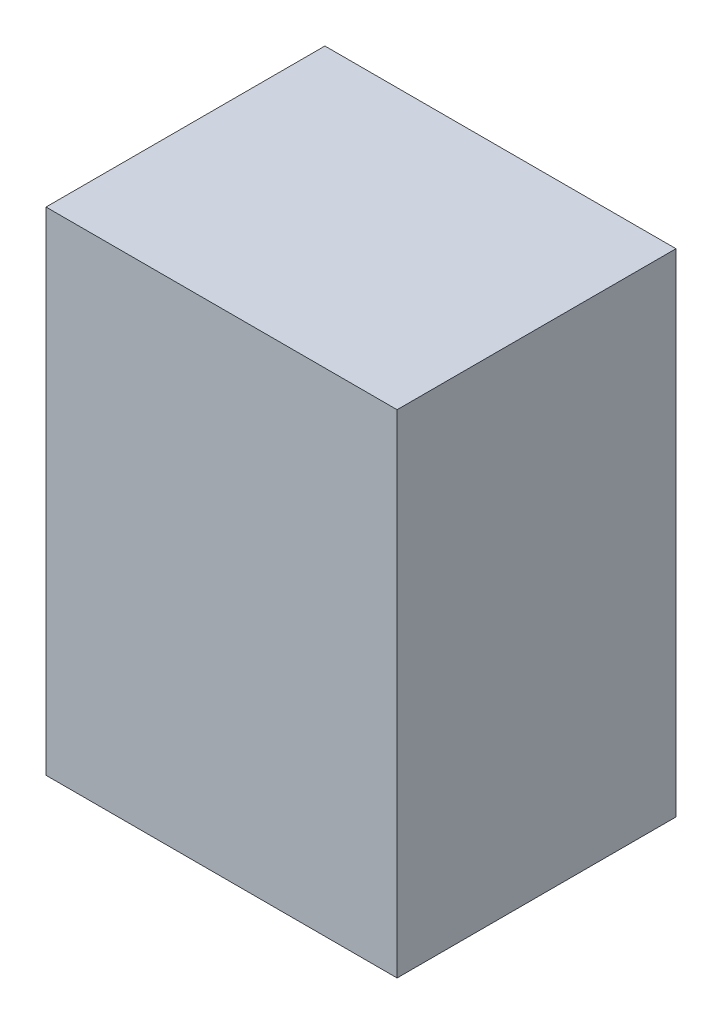
ISO-10303-21;
HEADER;
FILE_DESCRIPTION(('STEP AP214'),'2;1');
FILE_NAME('part.step','',(''),(''),'','','');
FILE_SCHEMA(('AUTOMOTIVE_DESIGN { 1 0 10303 214 1 1 1 1 }'));
ENDSEC;
DATA;
#1=APPLICATION_CONTEXT('core data for automotive mechanical design processes');
#2=APPLICATION_PROTOCOL_DEFINITION('international standard','automotive_design',2000,#1);
#3=PRODUCT_CONTEXT('',#1,'mechanical');
#4=PRODUCT('Part','Part','',(#3));
#5=PRODUCT_RELATED_PRODUCT_CATEGORY('part','',(#4));
#6=PRODUCT_DEFINITION_FORMATION('','',#4);
#7=PRODUCT_DEFINITION_CONTEXT('part definition',#1,'design');
#8=PRODUCT_DEFINITION('design','',#6,#7);
#9=PRODUCT_DEFINITION_SHAPE('','',#8);
#10=(LENGTH_UNIT() NAMED_UNIT(*) SI_UNIT(.MILLI.,.METRE.));
#11=(NAMED_UNIT(*) PLANE_ANGLE_UNIT() SI_UNIT($,.RADIAN.));
#12=(NAMED_UNIT(*) SI_UNIT($,.STERADIAN.) SOLID_ANGLE_UNIT());
#13=UNCERTAINTY_MEASURE_WITH_UNIT(LENGTH_MEASURE(1.E-05),#10,'distance_accuracy_value','');
#14=(GEOMETRIC_REPRESENTATION_CONTEXT(3) GLOBAL_UNCERTAINTY_ASSIGNED_CONTEXT((#13)) GLOBAL_UNIT_ASSIGNED_CONTEXT((#10,
#11,#12)) REPRESENTATION_CONTEXT('',''));
#15=CARTESIAN_POINT('',(0.,0.,0.));
#16=DIRECTION('',(0.,0.,1.));
#17=DIRECTION('',(1.,0.,0.));
#18=AXIS2_PLACEMENT_3D('',#15,#16,#17);
#19=CARTESIAN_POINT('',(0.,0.,85.));
#20=DIRECTION('',(1.,0.,0.));
#21=DIRECTION('',(0.,1.,0.));
#22=AXIS2_PLACEMENT_3D('',#19,#20,#21);
#23=PLANE('',#22);
#24=DIRECTION('',(0.,-1.,0.));
#25=VECTOR('',#24,1.);
#26=CARTESIAN_POINT('',(0.,0.,0.));
#27=LINE('',#26,#25);
#28=CARTESIAN_POINT('',(0.,150.,0.));
#29=VERTEX_POINT('',#28);
#30=CARTESIAN_POINT('',(0.,0.,0.));
#31=VERTEX_POINT('',#30);
#32=EDGE_CURVE('E96',#29,#31,#27,.T.);
#33=ORIENTED_EDGE('',*,*,#32,.T.);
#34=DIRECTION('',(0.,0.,-1.));
#35=VECTOR('',#34,1.);
#36=CARTESIAN_POINT('',(0.,0.,85.));
#37=LINE('',#36,#35);
#38=CARTESIAN_POINT('',(0.,0.,85.));
#39=VERTEX_POINT('',#38);
#40=EDGE_CURVE('E11',#39,#31,#37,.T.);
#41=ORIENTED_EDGE('',*,*,#40,.F.);
#42=DIRECTION('',(0.,-1.,0.));
#43=VECTOR('',#42,1.);
#44=CARTESIAN_POINT('',(0.,0.,85.));
#45=LINE('',#44,#43);
#46=CARTESIAN_POINT('',(0.,150.,85.));
#47=VERTEX_POINT('',#46);
#48=EDGE_CURVE('E84',#47,#39,#45,.T.);
#49=ORIENTED_EDGE('',*,*,#48,.F.);
#50=DIRECTION('',(0.,0.,-1.));
#51=VECTOR('',#50,1.);
#52=CARTESIAN_POINT('',(0.,150.,85.));
#53=LINE('',#52,#51);
#54=EDGE_CURVE('E92',#47,#29,#53,.T.);
#55=ORIENTED_EDGE('',*,*,#54,.T.);
#56=EDGE_LOOP('',(#33,#41,#49,#55));
#57=FACE_BOUND('',#56,.T.);
#58=ADVANCED_FACE('F33',(#57),#23,.F.);
#59=CARTESIAN_POINT('',(0.,0.,85.));
#60=DIRECTION('',(0.,1.,0.));
#61=DIRECTION('',(0.,0.,1.));
#62=AXIS2_PLACEMENT_3D('',#59,#60,#61);
#63=PLANE('',#62);
#64=DIRECTION('',(1.,0.,0.));
#65=VECTOR('',#64,1.);
#66=CARTESIAN_POINT('',(0.,0.,0.));
#67=LINE('',#66,#65);
#68=CARTESIAN_POINT('',(107.,0.,0.));
#69=VERTEX_POINT('',#68);
#70=EDGE_CURVE('E88',#31,#69,#67,.T.);
#71=ORIENTED_EDGE('',*,*,#70,.T.);
#72=DIRECTION('',(0.,0.,-1.));
#73=VECTOR('',#72,1.);
#74=CARTESIAN_POINT('',(107.,0.,85.));
#75=LINE('',#74,#73);
#76=CARTESIAN_POINT('',(107.,0.,85.));
#77=VERTEX_POINT('',#76);
#78=EDGE_CURVE('E41',#77,#69,#75,.T.);
#79=ORIENTED_EDGE('',*,*,#78,.F.);
#80=DIRECTION('',(1.,0.,0.));
#81=VECTOR('',#80,1.);
#82=CARTESIAN_POINT('',(0.,0.,85.));
#83=LINE('',#82,#81);
#84=EDGE_CURVE('E79',#39,#77,#83,.T.);
#85=ORIENTED_EDGE('',*,*,#84,.F.);
#86=ORIENTED_EDGE('',*,*,#40,.T.);
#87=EDGE_LOOP('',(#71,#79,#85,#86));
#88=FACE_BOUND('',#87,.T.);
#89=ADVANCED_FACE('F87',(#88),#63,.F.);
#90=CARTESIAN_POINT('',(107.,0.,85.));
#91=DIRECTION('',(-1.,0.,0.));
#92=DIRECTION('',(0.,-1.,0.));
#93=AXIS2_PLACEMENT_3D('',#90,#91,#92);
#94=PLANE('',#93);
#95=DIRECTION('',(0.,1.,0.));
#96=VECTOR('',#95,1.);
#97=CARTESIAN_POINT('',(107.,0.,0.));
#98=LINE('',#97,#96);
#99=CARTESIAN_POINT('',(107.,150.,0.));
#100=VERTEX_POINT('',#99);
#101=EDGE_CURVE('E66',#69,#100,#98,.T.);
#102=ORIENTED_EDGE('',*,*,#101,.T.);
#103=DIRECTION('',(0.,0.,-1.));
#104=VECTOR('',#103,1.);
#105=CARTESIAN_POINT('',(107.,150.,85.));
#106=LINE('',#105,#104);
#107=CARTESIAN_POINT('',(107.,150.,85.));
#108=VERTEX_POINT('',#107);
#109=EDGE_CURVE('E89',#108,#100,#106,.T.);
#110=ORIENTED_EDGE('',*,*,#109,.F.);
#111=DIRECTION('',(0.,1.,0.));
#112=VECTOR('',#111,1.);
#113=CARTESIAN_POINT('',(107.,0.,85.));
#114=LINE('',#113,#112);
#115=EDGE_CURVE('E82',#77,#108,#114,.T.);
#116=ORIENTED_EDGE('',*,*,#115,.F.);
#117=ORIENTED_EDGE('',*,*,#78,.T.);
#118=EDGE_LOOP('',(#102,#110,#116,#117));
#119=FACE_BOUND('',#118,.T.);
#120=ADVANCED_FACE('F90',(#119),#94,.F.);
#121=CARTESIAN_POINT('',(0.,150.,85.));
#122=DIRECTION('',(0.,-1.,0.));
#123=DIRECTION('',(0.,0.,-1.));
#124=AXIS2_PLACEMENT_3D('',#121,#122,#123);
#125=PLANE('',#124);
#126=DIRECTION('',(-1.,0.,0.));
#127=VECTOR('',#126,1.);
#128=CARTESIAN_POINT('',(0.,150.,0.));
#129=LINE('',#128,#127);
#130=EDGE_CURVE('E72',#100,#29,#129,.T.);
#131=ORIENTED_EDGE('',*,*,#130,.T.);
#132=ORIENTED_EDGE('',*,*,#54,.F.);
#133=DIRECTION('',(-1.,0.,0.));
#134=VECTOR('',#133,1.);
#135=CARTESIAN_POINT('',(0.,150.,85.));
#136=LINE('',#135,#134);
#137=EDGE_CURVE('E49',#108,#47,#136,.T.);
#138=ORIENTED_EDGE('',*,*,#137,.F.);
#139=ORIENTED_EDGE('',*,*,#109,.T.);
#140=EDGE_LOOP('',(#131,#132,#138,#139));
#141=FACE_BOUND('',#140,.T.);
#142=ADVANCED_FACE('F103',(#141),#125,.F.);
#143=CARTESIAN_POINT('',(0.,0.,85.));
#144=DIRECTION('',(0.,0.,-1.));
#145=DIRECTION('',(-1.,0.,0.));
#146=AXIS2_PLACEMENT_3D('',#143,#144,#145);
#147=PLANE('',#146);
#148=ORIENTED_EDGE('',*,*,#48,.T.);
#149=ORIENTED_EDGE('',*,*,#84,.T.);
#150=ORIENTED_EDGE('',*,*,#115,.T.);
#151=ORIENTED_EDGE('',*,*,#137,.T.);
#152=EDGE_LOOP('',(#148,#149,#150,#151));
#153=FACE_BOUND('',#152,.T.);
#154=ADVANCED_FACE('F80',(#153),#147,.F.);
#155=CARTESIAN_POINT('',(0.,0.,0.));
#156=DIRECTION('',(0.,0.,-1.));
#157=DIRECTION('',(-1.,0.,0.));
#158=AXIS2_PLACEMENT_3D('',#155,#156,#157);
#159=PLANE('',#158);
#160=ORIENTED_EDGE('',*,*,#32,.F.);
#161=ORIENTED_EDGE('',*,*,#130,.F.);
#162=ORIENTED_EDGE('',*,*,#101,.F.);
#163=ORIENTED_EDGE('',*,*,#70,.F.);
#164=EDGE_LOOP('',(#160,#161,#162,#163));
#165=FACE_BOUND('',#164,.T.);
#166=ADVANCED_FACE('F106',(#165),#159,.T.);
#167=CLOSED_SHELL('',(#58,#89,#120,#142,#154,#166));
#168=MANIFOLD_SOLID_BREP('B2',#167);
#169=ADVANCED_BREP_SHAPE_REPRESENTATION('',(#18,#168),#14);
#170=SHAPE_DEFINITION_REPRESENTATION(#9,#169);
ENDSEC;
END-ISO-10303-21;
